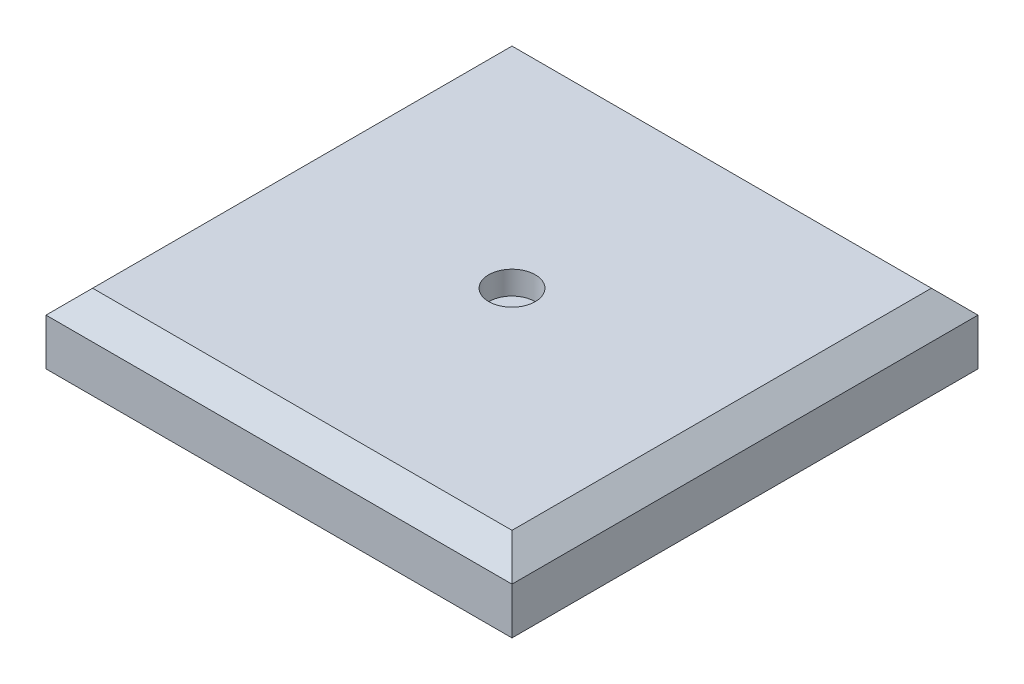
ISO-10303-21;
HEADER;
FILE_DESCRIPTION(('STEP AP214'),'2;1');
FILE_NAME('part.step','',(''),(''),'','','');
FILE_SCHEMA(('AUTOMOTIVE_DESIGN { 1 0 10303 214 1 1 1 1 }'));
ENDSEC;
DATA;
#1=APPLICATION_CONTEXT('core data for automotive mechanical design processes');
#2=APPLICATION_PROTOCOL_DEFINITION('international standard','automotive_design',2000,#1);
#3=PRODUCT_CONTEXT('',#1,'mechanical');
#4=PRODUCT('Part','Part','',(#3));
#5=PRODUCT_RELATED_PRODUCT_CATEGORY('part','',(#4));
#6=PRODUCT_DEFINITION_FORMATION('','',#4);
#7=PRODUCT_DEFINITION_CONTEXT('part definition',#1,'design');
#8=PRODUCT_DEFINITION('design','',#6,#7);
#9=PRODUCT_DEFINITION_SHAPE('','',#8);
#10=(LENGTH_UNIT() NAMED_UNIT(*) SI_UNIT(.MILLI.,.METRE.));
#11=(NAMED_UNIT(*) PLANE_ANGLE_UNIT() SI_UNIT($,.RADIAN.));
#12=(NAMED_UNIT(*) SI_UNIT($,.STERADIAN.) SOLID_ANGLE_UNIT());
#13=UNCERTAINTY_MEASURE_WITH_UNIT(LENGTH_MEASURE(1.E-05),#10,'distance_accuracy_value','');
#14=(GEOMETRIC_REPRESENTATION_CONTEXT(3) GLOBAL_UNCERTAINTY_ASSIGNED_CONTEXT((#13)) GLOBAL_UNIT_ASSIGNED_CONTEXT((#10,
#11,#12)) REPRESENTATION_CONTEXT('',''));
#15=CARTESIAN_POINT('',(0.,0.,0.));
#16=DIRECTION('',(0.,0.,1.));
#17=DIRECTION('',(1.,0.,0.));
#18=AXIS2_PLACEMENT_3D('',#15,#16,#17);
#19=CARTESIAN_POINT('',(0.,15.,0.));
#20=DIRECTION('',(1.,0.,0.));
#21=DIRECTION('',(0.,0.,-1.));
#22=AXIS2_PLACEMENT_3D('',#19,#20,#21);
#23=PLANE('',#22);
#24=DIRECTION('',(0.,-1.,0.));
#25=VECTOR('',#24,1.);
#26=CARTESIAN_POINT('',(0.,15.,0.));
#27=LINE('',#26,#25);
#28=CARTESIAN_POINT('',(0.,9.99999999999999,0.));
#29=VERTEX_POINT('',#28);
#30=CARTESIAN_POINT('',(0.,0.,0.));
#31=VERTEX_POINT('',#30);
#32=EDGE_CURVE('E92',#29,#31,#27,.T.);
#33=ORIENTED_EDGE('',*,*,#32,.F.);
#34=DIRECTION('',(0.,0.,-1.));
#35=VECTOR('',#34,1.);
#36=CARTESIAN_POINT('',(0.,9.99999999999999,0.));
#37=LINE('',#36,#35);
#38=CARTESIAN_POINT('',(0.,9.99999999999999,-100.));
#39=VERTEX_POINT('',#38);
#40=EDGE_CURVE('E11',#29,#39,#37,.T.);
#41=ORIENTED_EDGE('',*,*,#40,.T.);
#42=DIRECTION('',(0.,-1.,0.));
#43=VECTOR('',#42,1.);
#44=CARTESIAN_POINT('',(0.,15.,-100.));
#45=LINE('',#44,#43);
#46=CARTESIAN_POINT('',(0.,0.,-100.));
#47=VERTEX_POINT('',#46);
#48=EDGE_CURVE('E114',#39,#47,#45,.T.);
#49=ORIENTED_EDGE('',*,*,#48,.T.);
#50=DIRECTION('',(0.,0.,1.));
#51=VECTOR('',#50,1.);
#52=CARTESIAN_POINT('',(0.,0.,0.));
#53=LINE('',#52,#51);
#54=EDGE_CURVE('E108',#47,#31,#53,.T.);
#55=ORIENTED_EDGE('',*,*,#54,.T.);
#56=EDGE_LOOP('',(#33,#41,#49,#55));
#57=FACE_BOUND('',#56,.T.);
#58=ADVANCED_FACE('F39',(#57),#23,.F.);
#59=CARTESIAN_POINT('',(0.,15.,0.));
#60=DIRECTION('',(0.,0.,-1.));
#61=DIRECTION('',(-1.,0.,0.));
#62=AXIS2_PLACEMENT_3D('',#59,#60,#61);
#63=PLANE('',#62);
#64=DIRECTION('',(0.,-1.,0.));
#65=VECTOR('',#64,1.);
#66=CARTESIAN_POINT('',(100.,15.,0.));
#67=LINE('',#66,#65);
#68=CARTESIAN_POINT('',(100.,9.99999999999999,0.));
#69=VERTEX_POINT('',#68);
#70=CARTESIAN_POINT('',(100.,0.,0.));
#71=VERTEX_POINT('',#70);
#72=EDGE_CURVE('E102',#69,#71,#67,.T.);
#73=ORIENTED_EDGE('',*,*,#72,.F.);
#74=DIRECTION('',(-1.,0.,0.));
#75=VECTOR('',#74,1.);
#76=CARTESIAN_POINT('',(0.,9.99999999999999,0.));
#77=LINE('',#76,#75);
#78=EDGE_CURVE('E49',#69,#29,#77,.T.);
#79=ORIENTED_EDGE('',*,*,#78,.T.);
#80=ORIENTED_EDGE('',*,*,#32,.T.);
#81=DIRECTION('',(1.,0.,0.));
#82=VECTOR('',#81,1.);
#83=CARTESIAN_POINT('',(0.,0.,0.));
#84=LINE('',#83,#82);
#85=EDGE_CURVE('E95',#31,#71,#84,.T.);
#86=ORIENTED_EDGE('',*,*,#85,.T.);
#87=EDGE_LOOP('',(#73,#79,#80,#86));
#88=FACE_BOUND('',#87,.T.);
#89=ADVANCED_FACE('F94',(#88),#63,.F.);
#90=CARTESIAN_POINT('',(100.,15.,0.));
#91=DIRECTION('',(-1.,0.,0.));
#92=DIRECTION('',(0.,0.,1.));
#93=AXIS2_PLACEMENT_3D('',#90,#91,#92);
#94=PLANE('',#93);
#95=DIRECTION('',(0.,-1.,0.));
#96=VECTOR('',#95,1.);
#97=CARTESIAN_POINT('',(100.,15.,-100.));
#98=LINE('',#97,#96);
#99=CARTESIAN_POINT('',(100.,9.99999999999999,-100.));
#100=VERTEX_POINT('',#99);
#101=CARTESIAN_POINT('',(100.,0.,-100.));
#102=VERTEX_POINT('',#101);
#103=EDGE_CURVE('E132',#100,#102,#98,.T.);
#104=ORIENTED_EDGE('',*,*,#103,.F.);
#105=DIRECTION('',(0.,0.,1.));
#106=VECTOR('',#105,1.);
#107=CARTESIAN_POINT('',(100.,9.99999999999999,0.));
#108=LINE('',#107,#106);
#109=EDGE_CURVE('E64',#100,#69,#108,.T.);
#110=ORIENTED_EDGE('',*,*,#109,.T.);
#111=ORIENTED_EDGE('',*,*,#72,.T.);
#112=DIRECTION('',(0.,0.,-1.));
#113=VECTOR('',#112,1.);
#114=CARTESIAN_POINT('',(100.,0.,0.));
#115=LINE('',#114,#113);
#116=EDGE_CURVE('E110',#71,#102,#115,.T.);
#117=ORIENTED_EDGE('',*,*,#116,.T.);
#118=EDGE_LOOP('',(#104,#110,#111,#117));
#119=FACE_BOUND('',#118,.T.);
#120=ADVANCED_FACE('F183',(#119),#94,.F.);
#121=CARTESIAN_POINT('',(0.,15.,-100.));
#122=DIRECTION('',(0.,0.,1.));
#123=DIRECTION('',(1.,0.,0.));
#124=AXIS2_PLACEMENT_3D('',#121,#122,#123);
#125=PLANE('',#124);
#126=ORIENTED_EDGE('',*,*,#48,.F.);
#127=DIRECTION('',(1.,0.,0.));
#128=VECTOR('',#127,1.);
#129=CARTESIAN_POINT('',(0.,9.99999999999999,-100.));
#130=LINE('',#129,#128);
#131=EDGE_CURVE('E149',#39,#100,#130,.T.);
#132=ORIENTED_EDGE('',*,*,#131,.T.);
#133=ORIENTED_EDGE('',*,*,#103,.T.);
#134=DIRECTION('',(-1.,0.,0.));
#135=VECTOR('',#134,1.);
#136=CARTESIAN_POINT('',(0.,0.,-100.));
#137=LINE('',#136,#135);
#138=EDGE_CURVE('E127',#102,#47,#137,.T.);
#139=ORIENTED_EDGE('',*,*,#138,.T.);
#140=EDGE_LOOP('',(#126,#132,#133,#139));
#141=FACE_BOUND('',#140,.T.);
#142=ADVANCED_FACE('F182',(#141),#125,.F.);
#143=CARTESIAN_POINT('',(0.,15.,0.));
#144=DIRECTION('',(0.,-1.,0.));
#145=DIRECTION('',(0.,0.,-1.));
#146=AXIS2_PLACEMENT_3D('',#143,#144,#145);
#147=PLANE('',#146);
#148=CARTESIAN_POINT('',(50.,15.,-50.));
#149=DIRECTION('',(0.,1.,0.));
#150=DIRECTION('',(0.,0.,1.));
#151=AXIS2_PLACEMENT_3D('',#148,#149,#150);
#152=CIRCLE('',#151,5.);
#153=CARTESIAN_POINT('',(50.,15.,-45.));
#154=VERTEX_POINT('',#153);
#155=EDGE_CURVE('E122',#154,#154,#152,.T.);
#156=ORIENTED_EDGE('',*,*,#155,.F.);
#157=EDGE_LOOP('',(#156));
#158=FACE_BOUND('',#157,.T.);
#159=DIRECTION('',(0.,0.,-1.));
#160=VECTOR('',#159,1.);
#161=CARTESIAN_POINT('',(95.,15.,0.));
#162=LINE('',#161,#160);
#163=CARTESIAN_POINT('',(95.,15.,-4.99999999999999));
#164=VERTEX_POINT('',#163);
#165=CARTESIAN_POINT('',(95.,15.,-95.));
#166=VERTEX_POINT('',#165);
#167=EDGE_CURVE('E142',#164,#166,#162,.T.);
#168=ORIENTED_EDGE('',*,*,#167,.T.);
#169=DIRECTION('',(-1.,0.,0.));
#170=VECTOR('',#169,1.);
#171=CARTESIAN_POINT('',(0.,15.,-95.));
#172=LINE('',#171,#170);
#173=CARTESIAN_POINT('',(4.99999999999999,15.,-95.));
#174=VERTEX_POINT('',#173);
#175=EDGE_CURVE('E145',#166,#174,#172,.T.);
#176=ORIENTED_EDGE('',*,*,#175,.T.);
#177=DIRECTION('',(0.,0.,1.));
#178=VECTOR('',#177,1.);
#179=CARTESIAN_POINT('',(4.99999999999999,15.,0.));
#180=LINE('',#179,#178);
#181=CARTESIAN_POINT('',(4.99999999999999,15.,-4.99999999999999));
#182=VERTEX_POINT('',#181);
#183=EDGE_CURVE('E101',#174,#182,#180,.T.);
#184=ORIENTED_EDGE('',*,*,#183,.T.);
#185=DIRECTION('',(1.,0.,0.));
#186=VECTOR('',#185,1.);
#187=CARTESIAN_POINT('',(0.,15.,-4.99999999999999));
#188=LINE('',#187,#186);
#189=EDGE_CURVE('E139',#182,#164,#188,.T.);
#190=ORIENTED_EDGE('',*,*,#189,.T.);
#191=EDGE_LOOP('',(#168,#176,#184,#190));
#192=FACE_BOUND('',#191,.T.);
#193=ADVANCED_FACE('F175',(#158,#192),#147,.F.);
#194=CARTESIAN_POINT('',(0.,0.,0.));
#195=DIRECTION('',(0.,-1.,0.));
#196=DIRECTION('',(0.,0.,-1.));
#197=AXIS2_PLACEMENT_3D('',#194,#195,#196);
#198=PLANE('',#197);
#199=ORIENTED_EDGE('',*,*,#54,.F.);
#200=ORIENTED_EDGE('',*,*,#138,.F.);
#201=ORIENTED_EDGE('',*,*,#116,.F.);
#202=ORIENTED_EDGE('',*,*,#85,.F.);
#203=EDGE_LOOP('',(#199,#200,#201,#202));
#204=FACE_BOUND('',#203,.T.);
#205=ADVANCED_FACE('F106',(#204),#198,.T.);
#206=CARTESIAN_POINT('',(0.,15.,-4.99999999999999));
#207=DIRECTION('',(0.,-0.707106781186546,-0.707106781186548));
#208=DIRECTION('',(1.,0.,0.));
#209=AXIS2_PLACEMENT_3D('',#206,#207,#208);
#210=PLANE('',#209);
#211=DIRECTION('',(0.577350269189625,0.577350269189627,-0.577350269189625));
#212=VECTOR('',#211,1.);
#213=CARTESIAN_POINT('',(3.33333333333333,13.3333333333333,-3.33333333333333));
#214=LINE('',#213,#212);
#215=EDGE_CURVE('E120',#29,#182,#214,.T.);
#216=ORIENTED_EDGE('',*,*,#215,.F.);
#217=ORIENTED_EDGE('',*,*,#78,.F.);
#218=DIRECTION('',(-0.577350269189625,0.577350269189627,-0.577350269189625));
#219=VECTOR('',#218,1.);
#220=CARTESIAN_POINT('',(63.3333333333334,46.6666666666667,-36.6666666666666));
#221=LINE('',#220,#219);
#222=EDGE_CURVE('E43',#164,#69,#221,.F.);
#223=ORIENTED_EDGE('',*,*,#222,.F.);
#224=ORIENTED_EDGE('',*,*,#189,.F.);
#225=EDGE_LOOP('',(#216,#217,#223,#224));
#226=FACE_BOUND('',#225,.T.);
#227=ADVANCED_FACE('F41',(#226),#210,.F.);
#228=CARTESIAN_POINT('',(95.,15.,0.));
#229=DIRECTION('',(-0.707106781186548,-0.707106781186546,0.));
#230=DIRECTION('',(0.,0.,-1.));
#231=AXIS2_PLACEMENT_3D('',#228,#229,#230);
#232=PLANE('',#231);
#233=ORIENTED_EDGE('',*,*,#222,.T.);
#234=ORIENTED_EDGE('',*,*,#109,.F.);
#235=DIRECTION('',(-0.577350269189625,0.577350269189627,0.577350269189625));
#236=VECTOR('',#235,1.);
#237=CARTESIAN_POINT('',(63.3333333333334,46.6666666666667,-63.3333333333334));
#238=LINE('',#237,#236);
#239=EDGE_CURVE('E160',#166,#100,#238,.F.);
#240=ORIENTED_EDGE('',*,*,#239,.F.);
#241=ORIENTED_EDGE('',*,*,#167,.F.);
#242=EDGE_LOOP('',(#233,#234,#240,#241));
#243=FACE_BOUND('',#242,.T.);
#244=ADVANCED_FACE('F201',(#243),#232,.F.);
#245=CARTESIAN_POINT('',(4.99999999999999,15.,0.));
#246=DIRECTION('',(0.707106781186548,-0.707106781186546,0.));
#247=DIRECTION('',(0.,0.,1.));
#248=AXIS2_PLACEMENT_3D('',#245,#246,#247);
#249=PLANE('',#248);
#250=ORIENTED_EDGE('',*,*,#215,.T.);
#251=ORIENTED_EDGE('',*,*,#183,.F.);
#252=DIRECTION('',(-0.577350269189625,-0.577350269189627,-0.577350269189625));
#253=VECTOR('',#252,1.);
#254=CARTESIAN_POINT('',(36.6666666666666,46.6666666666667,-63.3333333333334));
#255=LINE('',#254,#253);
#256=EDGE_CURVE('E157',#39,#174,#255,.F.);
#257=ORIENTED_EDGE('',*,*,#256,.F.);
#258=ORIENTED_EDGE('',*,*,#40,.F.);
#259=EDGE_LOOP('',(#250,#251,#257,#258));
#260=FACE_BOUND('',#259,.T.);
#261=ADVANCED_FACE('F168',(#260),#249,.F.);
#262=CARTESIAN_POINT('',(0.,15.,-95.));
#263=DIRECTION('',(0.,-0.707106781186546,0.707106781186548));
#264=DIRECTION('',(-1.,0.,0.));
#265=AXIS2_PLACEMENT_3D('',#262,#263,#264);
#266=PLANE('',#265);
#267=ORIENTED_EDGE('',*,*,#239,.T.);
#268=ORIENTED_EDGE('',*,*,#131,.F.);
#269=ORIENTED_EDGE('',*,*,#256,.T.);
#270=ORIENTED_EDGE('',*,*,#175,.F.);
#271=EDGE_LOOP('',(#267,#268,#269,#270));
#272=FACE_BOUND('',#271,.T.);
#273=ADVANCED_FACE('F179',(#272),#266,.F.);
#274=CARTESIAN_POINT('',(50.,10.,-50.));
#275=DIRECTION('',(0.,1.,0.));
#276=DIRECTION('',(0.,0.,1.));
#277=AXIS2_PLACEMENT_3D('',#274,#275,#276);
#278=CYLINDRICAL_SURFACE('',#277,5.);
#279=CARTESIAN_POINT('',(50.,10.,-50.));
#280=DIRECTION('',(0.,1.,0.));
#281=DIRECTION('',(0.,0.,1.));
#282=AXIS2_PLACEMENT_3D('',#279,#280,#281);
#283=CIRCLE('',#282,5.);
#284=CARTESIAN_POINT('',(50.,10.,-45.));
#285=VERTEX_POINT('',#284);
#286=EDGE_CURVE('E161',#285,#285,#283,.T.);
#287=ORIENTED_EDGE('',*,*,#286,.F.);
#288=EDGE_LOOP('',(#287));
#289=FACE_BOUND('',#288,.T.);
#290=ORIENTED_EDGE('',*,*,#155,.T.);
#291=EDGE_LOOP('',(#290));
#292=FACE_BOUND('',#291,.T.);
#293=ADVANCED_FACE('F199',(#289,#292),#278,.F.);
#294=CARTESIAN_POINT('',(50.,10.,-50.));
#295=DIRECTION('',(0.,1.,0.));
#296=DIRECTION('',(0.,0.,1.));
#297=AXIS2_PLACEMENT_3D('',#294,#295,#296);
#298=PLANE('',#297);
#299=ORIENTED_EDGE('',*,*,#286,.T.);
#300=EDGE_LOOP('',(#299));
#301=FACE_BOUND('',#300,.T.);
#302=ADVANCED_FACE('F219',(#301),#298,.T.);
#303=CLOSED_SHELL('',(#58,#89,#120,#142,#193,#205,#227,#244,#261,#273,#293,#302));
#304=MANIFOLD_SOLID_BREP('B2',#303);
#305=ADVANCED_BREP_SHAPE_REPRESENTATION('',(#18,#304),#14);
#306=SHAPE_DEFINITION_REPRESENTATION(#9,#305);
ENDSEC;
END-ISO-10303-21;
